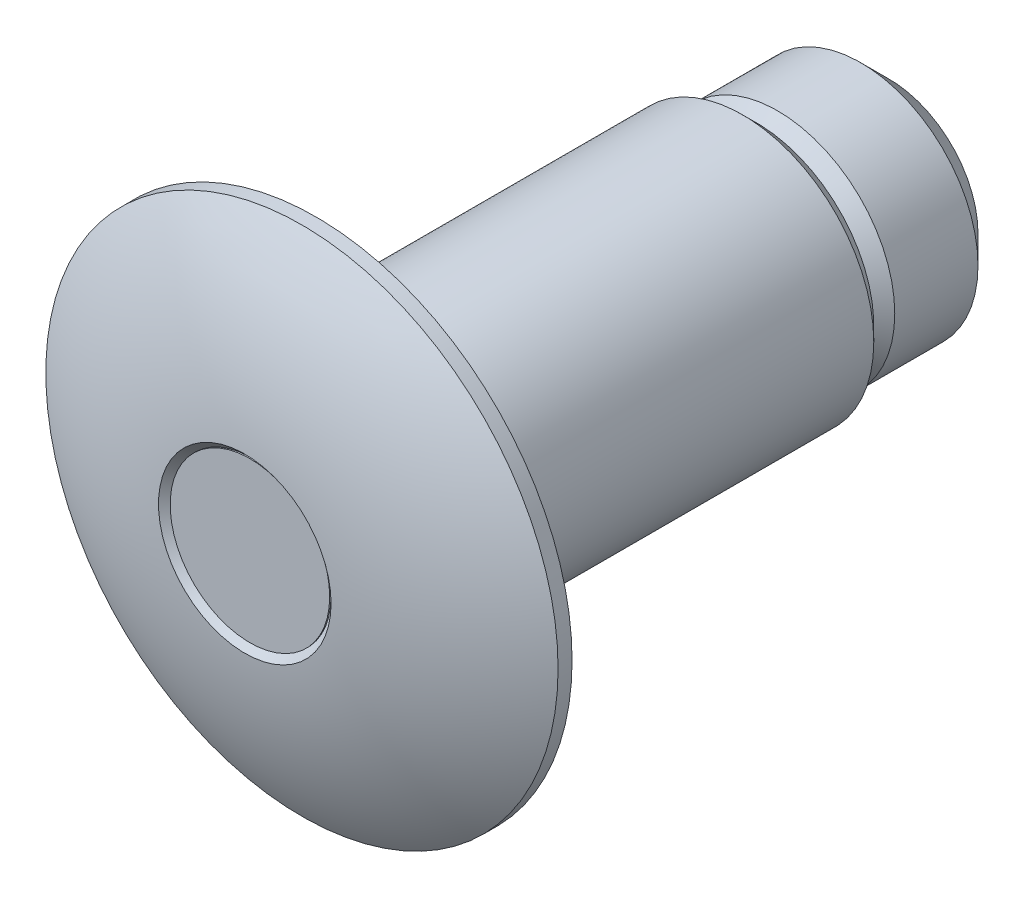
ISO-10303-21;
HEADER;
FILE_DESCRIPTION(('STEP AP214'),'2;1');
FILE_NAME('part.step','',(''),(''),'','','');
FILE_SCHEMA(('AUTOMOTIVE_DESIGN { 1 0 10303 214 1 1 1 1 }'));
ENDSEC;
DATA;
#1=APPLICATION_CONTEXT('core data for automotive mechanical design processes');
#2=APPLICATION_PROTOCOL_DEFINITION('international standard','automotive_design',2000,#1);
#3=PRODUCT_CONTEXT('',#1,'mechanical');
#4=PRODUCT('Part','Part','',(#3));
#5=PRODUCT_RELATED_PRODUCT_CATEGORY('part','',(#4));
#6=PRODUCT_DEFINITION_FORMATION('','',#4);
#7=PRODUCT_DEFINITION_CONTEXT('part definition',#1,'design');
#8=PRODUCT_DEFINITION('design','',#6,#7);
#9=PRODUCT_DEFINITION_SHAPE('','',#8);
#10=(LENGTH_UNIT() NAMED_UNIT(*) SI_UNIT(.MILLI.,.METRE.));
#11=(NAMED_UNIT(*) PLANE_ANGLE_UNIT() SI_UNIT($,.RADIAN.));
#12=(NAMED_UNIT(*) SI_UNIT($,.STERADIAN.) SOLID_ANGLE_UNIT());
#13=UNCERTAINTY_MEASURE_WITH_UNIT(LENGTH_MEASURE(1.E-05),#10,'distance_accuracy_value','');
#14=(GEOMETRIC_REPRESENTATION_CONTEXT(3) GLOBAL_UNCERTAINTY_ASSIGNED_CONTEXT((#13)) GLOBAL_UNIT_ASSIGNED_CONTEXT((#10,
#11,#12)) REPRESENTATION_CONTEXT('',''));
#15=CARTESIAN_POINT('',(0.,0.,0.));
#16=DIRECTION('',(0.,0.,1.));
#17=DIRECTION('',(1.,0.,0.));
#18=AXIS2_PLACEMENT_3D('',#15,#16,#17);
#19=CARTESIAN_POINT('',(-0.7239,0.,1.1984));
#20=DIRECTION('',(0.,0.,-1.));
#21=DIRECTION('',(-1.,0.,0.));
#22=AXIS2_PLACEMENT_3D('',#19,#20,#21);
#23=PLANE('',#22);
#24=CARTESIAN_POINT('',(0.,0.,1.1984));
#25=DIRECTION('',(0.,0.,1.));
#26=DIRECTION('',(1.,0.,0.));
#27=AXIS2_PLACEMENT_3D('',#24,#25,#26);
#28=CIRCLE('',#27,1.4478);
#29=CARTESIAN_POINT('',(1.4478,0.,1.1984));
#30=VERTEX_POINT('',#29);
#31=EDGE_CURVE('E32',#30,#30,#28,.T.);
#32=ORIENTED_EDGE('',*,*,#31,.T.);
#33=EDGE_LOOP('',(#32));
#34=FACE_BOUND('',#33,.T.);
#35=ADVANCED_FACE('F15',(#34),#23,.F.);
#36=CARTESIAN_POINT('',(0.,0.,-5.2));
#37=DIRECTION('',(0.,0.,1.));
#38=DIRECTION('',(1.,0.,0.));
#39=AXIS2_PLACEMENT_3D('',#36,#37,#38);
#40=CYLINDRICAL_SURFACE('',#39,1.4478);
#41=CARTESIAN_POINT('',(0.,0.,1.173));
#42=DIRECTION('',(0.,0.,1.));
#43=DIRECTION('',(1.,0.,0.));
#44=AXIS2_PLACEMENT_3D('',#41,#42,#43);
#45=CIRCLE('',#44,1.4478);
#46=CARTESIAN_POINT('',(1.4478,0.,1.173));
#47=VERTEX_POINT('',#46);
#48=EDGE_CURVE('E38',#47,#47,#45,.T.);
#49=ORIENTED_EDGE('',*,*,#48,.T.);
#50=EDGE_LOOP('',(#49));
#51=FACE_BOUND('',#50,.T.);
#52=ORIENTED_EDGE('',*,*,#31,.F.);
#53=EDGE_LOOP('',(#52));
#54=FACE_BOUND('',#53,.T.);
#55=ADVANCED_FACE('F88',(#51,#54),#40,.T.);
#56=CARTESIAN_POINT('',(0.,0.,1.173));
#57=DIRECTION('',(0.,0.,1.));
#58=DIRECTION('',(1.,0.,0.));
#59=AXIS2_PLACEMENT_3D('',#56,#57,#58);
#60=CONICAL_SURFACE('',#59,1.4478,0.785398163397467);
#61=CARTESIAN_POINT('',(0.,0.,1.29162775862113));
#62=DIRECTION('',(0.,0.,1.));
#63=DIRECTION('',(1.,0.,0.));
#64=AXIS2_PLACEMENT_3D('',#61,#62,#63);
#65=CIRCLE('',#64,1.56642775862114);
#66=CARTESIAN_POINT('',(1.56642775862113,0.,1.29162775862113));
#67=VERTEX_POINT('',#66);
#68=EDGE_CURVE('E43',#67,#67,#65,.T.);
#69=ORIENTED_EDGE('',*,*,#68,.T.);
#70=EDGE_LOOP('',(#69));
#71=FACE_BOUND('',#70,.T.);
#72=ORIENTED_EDGE('',*,*,#48,.F.);
#73=EDGE_LOOP('',(#72));
#74=FACE_BOUND('',#73,.T.);
#75=ADVANCED_FACE('F92',(#71,#74),#60,.F.);
#76=CARTESIAN_POINT('',(0.,0.,-5.38683361048861));
#77=DIRECTION('',(0.,0.,1.));
#78=DIRECTION('',(1.,0.,0.));
#79=AXIS2_PLACEMENT_3D('',#76,#77,#78);
#80=DEGENERATE_TOROIDAL_SURFACE('',#79,1.03548111405562,6.69953361048861,.T.);
#81=CARTESIAN_POINT('',(0.,0.,0.254));
#82=DIRECTION('',(0.,0.,1.));
#83=DIRECTION('',(1.,0.,0.));
#84=AXIS2_PLACEMENT_3D('',#81,#82,#83);
#85=CIRCLE('',#84,4.65);
#86=CARTESIAN_POINT('',(4.65,0.,0.254000000000001));
#87=VERTEX_POINT('',#86);
#88=EDGE_CURVE('E47',#87,#87,#85,.T.);
#89=ORIENTED_EDGE('',*,*,#88,.T.);
#90=EDGE_LOOP('',(#89));
#91=FACE_BOUND('',#90,.T.);
#92=ORIENTED_EDGE('',*,*,#68,.F.);
#93=EDGE_LOOP('',(#92));
#94=FACE_BOUND('',#93,.T.);
#95=ADVANCED_FACE('F98',(#91,#94),#80,.T.);
#96=CARTESIAN_POINT('',(0.,0.,-5.2));
#97=DIRECTION('',(0.,0.,1.));
#98=DIRECTION('',(1.,0.,0.));
#99=AXIS2_PLACEMENT_3D('',#96,#97,#98);
#100=CYLINDRICAL_SURFACE('',#99,4.65);
#101=ORIENTED_EDGE('',*,*,#88,.F.);
#102=EDGE_LOOP('',(#101));
#103=FACE_BOUND('',#102,.T.);
#104=CARTESIAN_POINT('',(0.,0.,0.));
#105=DIRECTION('',(0.,0.,1.));
#106=DIRECTION('',(1.,0.,0.));
#107=AXIS2_PLACEMENT_3D('',#104,#105,#106);
#108=CIRCLE('',#107,4.65);
#109=CARTESIAN_POINT('',(4.65,0.,0.));
#110=VERTEX_POINT('',#109);
#111=EDGE_CURVE('E51',#110,#110,#108,.T.);
#112=ORIENTED_EDGE('',*,*,#111,.T.);
#113=EDGE_LOOP('',(#112));
#114=FACE_BOUND('',#113,.T.);
#115=ADVANCED_FACE('F102',(#103,#114),#100,.T.);
#116=CARTESIAN_POINT('',(-3.515625,0.,0.));
#117=DIRECTION('',(0.,0.,-1.));
#118=DIRECTION('',(-1.,0.,0.));
#119=AXIS2_PLACEMENT_3D('',#116,#117,#118);
#120=PLANE('',#119);
#121=CARTESIAN_POINT('',(0.,0.,0.));
#122=DIRECTION('',(0.,0.,1.));
#123=DIRECTION('',(1.,0.,0.));
#124=AXIS2_PLACEMENT_3D('',#121,#122,#123);
#125=CIRCLE('',#124,2.38125);
#126=CARTESIAN_POINT('',(2.38125,0.,0.));
#127=VERTEX_POINT('',#126);
#128=EDGE_CURVE('E54',#127,#127,#125,.T.);
#129=ORIENTED_EDGE('',*,*,#128,.T.);
#130=EDGE_LOOP('',(#129));
#131=FACE_BOUND('',#130,.T.);
#132=ORIENTED_EDGE('',*,*,#111,.F.);
#133=EDGE_LOOP('',(#132));
#134=FACE_BOUND('',#133,.T.);
#135=ADVANCED_FACE('F106',(#131,#134),#120,.T.);
#136=CARTESIAN_POINT('',(0.,0.,-5.2));
#137=DIRECTION('',(0.,0.,1.));
#138=DIRECTION('',(1.,0.,0.));
#139=AXIS2_PLACEMENT_3D('',#136,#137,#138);
#140=CYLINDRICAL_SURFACE('',#139,2.38125);
#141=CARTESIAN_POINT('',(0.,0.,-7.746));
#142=DIRECTION('',(0.,0.,-1.));
#143=DIRECTION('',(-1.,0.,0.));
#144=AXIS2_PLACEMENT_3D('',#141,#142,#143);
#145=CIRCLE('',#144,2.38125);
#146=CARTESIAN_POINT('',(-2.38125,0.,-7.746));
#147=VERTEX_POINT('',#146);
#148=EDGE_CURVE('E24',#147,#147,#145,.F.);
#149=ORIENTED_EDGE('',*,*,#148,.T.);
#150=EDGE_LOOP('',(#149));
#151=FACE_BOUND('',#150,.T.);
#152=ORIENTED_EDGE('',*,*,#128,.F.);
#153=EDGE_LOOP('',(#152));
#154=FACE_BOUND('',#153,.T.);
#155=ADVANCED_FACE('F110',(#151,#154),#140,.T.);
#156=CARTESIAN_POINT('',(-2.06375,0.,-8.));
#157=DIRECTION('',(0.,0.,-1.));
#158=DIRECTION('',(-1.,0.,0.));
#159=AXIS2_PLACEMENT_3D('',#156,#157,#158);
#160=PLANE('',#159);
#161=CARTESIAN_POINT('',(0.,0.,-8.));
#162=DIRECTION('',(0.,0.,-1.));
#163=DIRECTION('',(-1.,0.,0.));
#164=AXIS2_PLACEMENT_3D('',#161,#162,#163);
#165=CIRCLE('',#164,2.12725);
#166=CARTESIAN_POINT('',(-2.12725,0.,-8.));
#167=VERTEX_POINT('',#166);
#168=EDGE_CURVE('E10',#167,#167,#165,.T.);
#169=ORIENTED_EDGE('',*,*,#168,.T.);
#170=EDGE_LOOP('',(#169));
#171=FACE_BOUND('',#170,.T.);
#172=CARTESIAN_POINT('',(0.,0.,-8.));
#173=DIRECTION('',(0.,0.,1.));
#174=DIRECTION('',(1.,0.,0.));
#175=AXIS2_PLACEMENT_3D('',#172,#173,#174);
#176=CIRCLE('',#175,1.74625);
#177=CARTESIAN_POINT('',(1.74625,0.,-8.));
#178=VERTEX_POINT('',#177);
#179=EDGE_CURVE('E58',#178,#178,#176,.T.);
#180=ORIENTED_EDGE('',*,*,#179,.T.);
#181=EDGE_LOOP('',(#180));
#182=FACE_BOUND('',#181,.T.);
#183=ADVANCED_FACE('F114',(#171,#182),#160,.T.);
#184=CARTESIAN_POINT('',(0.,0.,-8.));
#185=DIRECTION('',(0.,0.,-1.));
#186=DIRECTION('',(-1.,0.,0.));
#187=AXIS2_PLACEMENT_3D('',#184,#185,#186);
#188=CONICAL_SURFACE('',#187,1.74625,0.785398163397449);
#189=CARTESIAN_POINT('',(0.,0.,-8.381));
#190=DIRECTION('',(0.,0.,1.));
#191=DIRECTION('',(1.,0.,0.));
#192=AXIS2_PLACEMENT_3D('',#189,#190,#191);
#193=CIRCLE('',#192,2.12725);
#194=CARTESIAN_POINT('',(2.12725,0.,-8.381));
#195=VERTEX_POINT('',#194);
#196=EDGE_CURVE('E62',#195,#195,#193,.T.);
#197=ORIENTED_EDGE('',*,*,#196,.T.);
#198=EDGE_LOOP('',(#197));
#199=FACE_BOUND('',#198,.T.);
#200=ORIENTED_EDGE('',*,*,#179,.F.);
#201=EDGE_LOOP('',(#200));
#202=FACE_BOUND('',#201,.T.);
#203=ADVANCED_FACE('F117',(#199,#202),#188,.T.);
#204=CARTESIAN_POINT('',(0.,0.,-5.2));
#205=DIRECTION('',(0.,0.,1.));
#206=DIRECTION('',(1.,0.,0.));
#207=AXIS2_PLACEMENT_3D('',#204,#205,#206);
#208=CYLINDRICAL_SURFACE('',#207,2.12725);
#209=CARTESIAN_POINT('',(0.,0.,-9.892));
#210=DIRECTION('',(0.,0.,1.));
#211=DIRECTION('',(1.,0.,0.));
#212=AXIS2_PLACEMENT_3D('',#209,#210,#211);
#213=CIRCLE('',#212,2.12725);
#214=CARTESIAN_POINT('',(2.12725,0.,-9.892));
#215=VERTEX_POINT('',#214);
#216=EDGE_CURVE('E66',#215,#215,#213,.T.);
#217=ORIENTED_EDGE('',*,*,#216,.T.);
#218=EDGE_LOOP('',(#217));
#219=FACE_BOUND('',#218,.T.);
#220=ORIENTED_EDGE('',*,*,#196,.F.);
#221=EDGE_LOOP('',(#220));
#222=FACE_BOUND('',#221,.T.);
#223=ADVANCED_FACE('F85',(#219,#222),#208,.T.);
#224=CARTESIAN_POINT('',(0.,0.,-9.892));
#225=DIRECTION('',(0.,0.,1.));
#226=DIRECTION('',(1.,0.,0.));
#227=AXIS2_PLACEMENT_3D('',#224,#225,#226);
#228=CONICAL_SURFACE('',#227,2.12725,0.785398163397449);
#229=CARTESIAN_POINT('',(0.,0.,-10.4));
#230=DIRECTION('',(0.,0.,1.));
#231=DIRECTION('',(1.,0.,0.));
#232=AXIS2_PLACEMENT_3D('',#229,#230,#231);
#233=CIRCLE('',#232,1.61925);
#234=CARTESIAN_POINT('',(1.61925,0.,-10.4));
#235=VERTEX_POINT('',#234);
#236=EDGE_CURVE('E70',#235,#235,#233,.T.);
#237=ORIENTED_EDGE('',*,*,#236,.T.);
#238=EDGE_LOOP('',(#237));
#239=FACE_BOUND('',#238,.T.);
#240=ORIENTED_EDGE('',*,*,#216,.F.);
#241=EDGE_LOOP('',(#240));
#242=FACE_BOUND('',#241,.T.);
#243=ADVANCED_FACE('F74',(#239,#242),#228,.T.);
#244=CARTESIAN_POINT('',(-0.809625,0.,-10.4));
#245=DIRECTION('',(0.,0.,-1.));
#246=DIRECTION('',(-1.,0.,0.));
#247=AXIS2_PLACEMENT_3D('',#244,#245,#246);
#248=PLANE('',#247);
#249=ORIENTED_EDGE('',*,*,#236,.F.);
#250=EDGE_LOOP('',(#249));
#251=FACE_BOUND('',#250,.T.);
#252=ADVANCED_FACE('F77',(#251),#248,.T.);
#253=CARTESIAN_POINT('',(0.,0.,-7.746));
#254=DIRECTION('',(0.,0.,1.));
#255=DIRECTION('',(1.,0.,0.));
#256=AXIS2_PLACEMENT_3D('',#253,#254,#255);
#257=CONICAL_SURFACE('',#256,2.38125,0.785398163397445);
#258=ORIENTED_EDGE('',*,*,#168,.F.);
#259=EDGE_LOOP('',(#258));
#260=FACE_BOUND('',#259,.T.);
#261=ORIENTED_EDGE('',*,*,#148,.F.);
#262=EDGE_LOOP('',(#261));
#263=FACE_BOUND('',#262,.T.);
#264=ADVANCED_FACE('F18',(#260,#263),#257,.T.);
#265=CLOSED_SHELL('',(#35,#55,#75,#95,#115,#135,#155,#183,#203,#223,#243,#252,#264));
#266=MANIFOLD_SOLID_BREP('B1',#265);
#267=ADVANCED_BREP_SHAPE_REPRESENTATION('',(#18,#266),#14);
#268=SHAPE_DEFINITION_REPRESENTATION(#9,#267);
ENDSEC;
END-ISO-10303-21;
